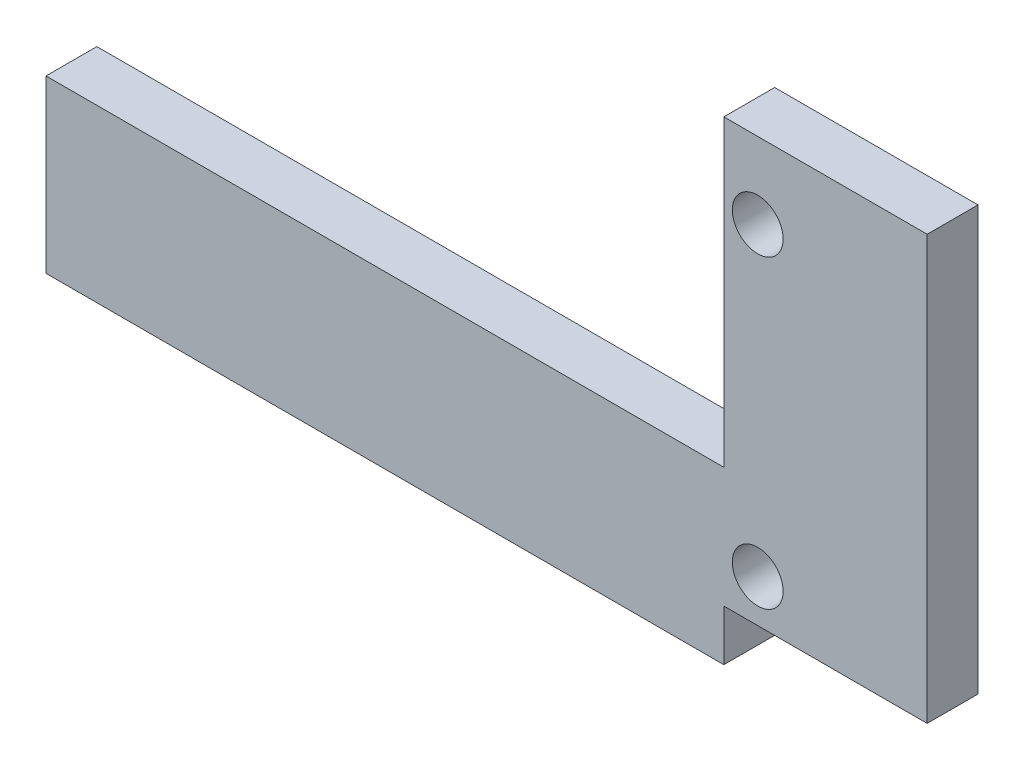
ISO-10303-21;
HEADER;
FILE_DESCRIPTION(('STEP AP214'),'2;1');
FILE_NAME('part.step','',(''),(''),'','','');
FILE_SCHEMA(('AUTOMOTIVE_DESIGN { 1 0 10303 214 1 1 1 1 }'));
ENDSEC;
DATA;
#1=APPLICATION_CONTEXT('core data for automotive mechanical design processes');
#2=APPLICATION_PROTOCOL_DEFINITION('international standard','automotive_design',2000,#1);
#3=PRODUCT_CONTEXT('',#1,'mechanical');
#4=PRODUCT('Part','Part','',(#3));
#5=PRODUCT_RELATED_PRODUCT_CATEGORY('part','',(#4));
#6=PRODUCT_DEFINITION_FORMATION('','',#4);
#7=PRODUCT_DEFINITION_CONTEXT('part definition',#1,'design');
#8=PRODUCT_DEFINITION('design','',#6,#7);
#9=PRODUCT_DEFINITION_SHAPE('','',#8);
#10=(LENGTH_UNIT() NAMED_UNIT(*) SI_UNIT(.MILLI.,.METRE.));
#11=(NAMED_UNIT(*) PLANE_ANGLE_UNIT() SI_UNIT($,.RADIAN.));
#12=(NAMED_UNIT(*) SI_UNIT($,.STERADIAN.) SOLID_ANGLE_UNIT());
#13=UNCERTAINTY_MEASURE_WITH_UNIT(LENGTH_MEASURE(1.E-05),#10,'distance_accuracy_value','');
#14=(GEOMETRIC_REPRESENTATION_CONTEXT(3) GLOBAL_UNCERTAINTY_ASSIGNED_CONTEXT((#13)) GLOBAL_UNIT_ASSIGNED_CONTEXT((#10,
#11,#12)) REPRESENTATION_CONTEXT('',''));
#15=CARTESIAN_POINT('',(0.,0.,0.));
#16=DIRECTION('',(0.,0.,1.));
#17=DIRECTION('',(1.,0.,0.));
#18=AXIS2_PLACEMENT_3D('',#15,#16,#17);
#19=CARTESIAN_POINT('',(-12.,0.,3.));
#20=DIRECTION('',(1.,0.,0.));
#21=DIRECTION('',(0.,0.,-1.));
#22=AXIS2_PLACEMENT_3D('',#19,#20,#21);
#23=PLANE('',#22);
#24=DIRECTION('',(0.,-1.,0.));
#25=VECTOR('',#24,1.);
#26=CARTESIAN_POINT('',(-12.,0.,0.));
#27=LINE('',#26,#25);
#28=CARTESIAN_POINT('',(-12.,25.,0.));
#29=VERTEX_POINT('',#28);
#30=CARTESIAN_POINT('',(-12.,7.09030838231861,0.));
#31=VERTEX_POINT('',#30);
#32=EDGE_CURVE('E108',#29,#31,#27,.T.);
#33=ORIENTED_EDGE('',*,*,#32,.T.);
#34=DIRECTION('',(0.,0.,-1.));
#35=VECTOR('',#34,1.);
#36=CARTESIAN_POINT('',(-12.,7.09030838231861,10.));
#37=LINE('',#36,#35);
#38=CARTESIAN_POINT('',(-12.,7.09030838231861,3.));
#39=VERTEX_POINT('',#38);
#40=EDGE_CURVE('E110',#39,#31,#37,.T.);
#41=ORIENTED_EDGE('',*,*,#40,.F.);
#42=DIRECTION('',(0.,-1.,0.));
#43=VECTOR('',#42,1.);
#44=CARTESIAN_POINT('',(-12.,0.,3.));
#45=LINE('',#44,#43);
#46=CARTESIAN_POINT('',(-12.,25.,3.));
#47=VERTEX_POINT('',#46);
#48=EDGE_CURVE('E161',#47,#39,#45,.T.);
#49=ORIENTED_EDGE('',*,*,#48,.F.);
#50=DIRECTION('',(0.,0.,-1.));
#51=VECTOR('',#50,1.);
#52=CARTESIAN_POINT('',(-12.,25.,3.));
#53=LINE('',#52,#51);
#54=EDGE_CURVE('E111',#47,#29,#53,.T.);
#55=ORIENTED_EDGE('',*,*,#54,.T.);
#56=EDGE_LOOP('',(#33,#41,#49,#55));
#57=FACE_BOUND('',#56,.T.);
#58=ADVANCED_FACE('F33',(#57),#23,.F.);
#59=CARTESIAN_POINT('',(0.,0.,3.));
#60=DIRECTION('',(-1.,0.,0.));
#61=DIRECTION('',(0.,0.,1.));
#62=AXIS2_PLACEMENT_3D('',#59,#60,#61);
#63=PLANE('',#62);
#64=DIRECTION('',(0.,1.,0.));
#65=VECTOR('',#64,1.);
#66=CARTESIAN_POINT('',(0.,0.,0.));
#67=LINE('',#66,#65);
#68=CARTESIAN_POINT('',(0.,0.,0.));
#69=VERTEX_POINT('',#68);
#70=CARTESIAN_POINT('',(0.,25.,0.));
#71=VERTEX_POINT('',#70);
#72=EDGE_CURVE('E157',#69,#71,#67,.T.);
#73=ORIENTED_EDGE('',*,*,#72,.T.);
#74=DIRECTION('',(0.,0.,-1.));
#75=VECTOR('',#74,1.);
#76=CARTESIAN_POINT('',(0.,25.,3.));
#77=LINE('',#76,#75);
#78=CARTESIAN_POINT('',(0.,25.,3.));
#79=VERTEX_POINT('',#78);
#80=EDGE_CURVE('E41',#79,#71,#77,.T.);
#81=ORIENTED_EDGE('',*,*,#80,.F.);
#82=DIRECTION('',(0.,1.,0.));
#83=VECTOR('',#82,1.);
#84=CARTESIAN_POINT('',(0.,0.,3.));
#85=LINE('',#84,#83);
#86=CARTESIAN_POINT('',(0.,0.,3.));
#87=VERTEX_POINT('',#86);
#88=EDGE_CURVE('E158',#87,#79,#85,.T.);
#89=ORIENTED_EDGE('',*,*,#88,.F.);
#90=DIRECTION('',(0.,0.,-1.));
#91=VECTOR('',#90,1.);
#92=CARTESIAN_POINT('',(0.,0.,3.));
#93=LINE('',#92,#91);
#94=EDGE_CURVE('E164',#87,#69,#93,.T.);
#95=ORIENTED_EDGE('',*,*,#94,.T.);
#96=EDGE_LOOP('',(#73,#81,#89,#95));
#97=FACE_BOUND('',#96,.T.);
#98=ADVANCED_FACE('F35',(#97),#63,.F.);
#99=CARTESIAN_POINT('',(0.,25.,3.));
#100=DIRECTION('',(0.,-1.,0.));
#101=DIRECTION('',(0.,0.,-1.));
#102=AXIS2_PLACEMENT_3D('',#99,#100,#101);
#103=PLANE('',#102);
#104=DIRECTION('',(-1.,0.,0.));
#105=VECTOR('',#104,1.);
#106=CARTESIAN_POINT('',(0.,25.,0.));
#107=LINE('',#106,#105);
#108=EDGE_CURVE('E113',#71,#29,#107,.T.);
#109=ORIENTED_EDGE('',*,*,#108,.T.);
#110=ORIENTED_EDGE('',*,*,#54,.F.);
#111=DIRECTION('',(-1.,0.,0.));
#112=VECTOR('',#111,1.);
#113=CARTESIAN_POINT('',(0.,25.,3.));
#114=LINE('',#113,#112);
#115=EDGE_CURVE('E84',#79,#47,#114,.T.);
#116=ORIENTED_EDGE('',*,*,#115,.F.);
#117=ORIENTED_EDGE('',*,*,#80,.T.);
#118=EDGE_LOOP('',(#109,#110,#116,#117));
#119=FACE_BOUND('',#118,.T.);
#120=ADVANCED_FACE('F173',(#119),#103,.F.);
#121=CARTESIAN_POINT('',(0.,0.,3.));
#122=DIRECTION('',(0.,1.,0.));
#123=DIRECTION('',(0.,0.,1.));
#124=AXIS2_PLACEMENT_3D('',#121,#122,#123);
#125=PLANE('',#124);
#126=DIRECTION('',(1.,0.,0.));
#127=VECTOR('',#126,1.);
#128=CARTESIAN_POINT('',(0.,0.,0.));
#129=LINE('',#128,#127);
#130=CARTESIAN_POINT('',(-12.,0.,0.));
#131=VERTEX_POINT('',#130);
#132=EDGE_CURVE('E76',#131,#69,#129,.T.);
#133=ORIENTED_EDGE('',*,*,#132,.T.);
#134=ORIENTED_EDGE('',*,*,#94,.F.);
#135=DIRECTION('',(1.,0.,0.));
#136=VECTOR('',#135,1.);
#137=CARTESIAN_POINT('',(0.,0.,3.));
#138=LINE('',#137,#136);
#139=CARTESIAN_POINT('',(-12.,0.,3.));
#140=VERTEX_POINT('',#139);
#141=EDGE_CURVE('E56',#140,#87,#138,.T.);
#142=ORIENTED_EDGE('',*,*,#141,.F.);
#143=DIRECTION('',(0.,0.,-1.));
#144=VECTOR('',#143,1.);
#145=CARTESIAN_POINT('',(-12.,0.,3.));
#146=LINE('',#145,#144);
#147=EDGE_CURVE('E170',#140,#131,#146,.T.);
#148=ORIENTED_EDGE('',*,*,#147,.T.);
#149=EDGE_LOOP('',(#133,#134,#142,#148));
#150=FACE_BOUND('',#149,.T.);
#151=ADVANCED_FACE('F193',(#150),#125,.F.);
#152=CARTESIAN_POINT('',(0.,0.,3.));
#153=DIRECTION('',(0.,0.,1.));
#154=DIRECTION('',(1.,0.,0.));
#155=AXIS2_PLACEMENT_3D('',#152,#153,#154);
#156=PLANE('',#155);
#157=ORIENTED_EDGE('',*,*,#48,.T.);
#158=DIRECTION('',(1.,0.,0.));
#159=VECTOR('',#158,1.);
#160=CARTESIAN_POINT('',(0.,7.09030838231861,3.));
#161=LINE('',#160,#159);
#162=CARTESIAN_POINT('',(-52.,7.09030838231861,3.));
#163=VERTEX_POINT('',#162);
#164=EDGE_CURVE('E118',#163,#39,#161,.T.);
#165=ORIENTED_EDGE('',*,*,#164,.F.);
#166=DIRECTION('',(0.,1.,0.));
#167=VECTOR('',#166,1.);
#168=CARTESIAN_POINT('',(-52.,11.0901796475247,3.));
#169=LINE('',#168,#167);
#170=CARTESIAN_POINT('',(-52.,-3.,3.));
#171=VERTEX_POINT('',#170);
#172=EDGE_CURVE('E132',#171,#163,#169,.T.);
#173=ORIENTED_EDGE('',*,*,#172,.F.);
#174=DIRECTION('',(1.,0.,0.));
#175=VECTOR('',#174,1.);
#176=CARTESIAN_POINT('',(-52.,-3.,3.));
#177=LINE('',#176,#175);
#178=CARTESIAN_POINT('',(-12.,-3.,3.));
#179=VERTEX_POINT('',#178);
#180=EDGE_CURVE('E135',#171,#179,#177,.T.);
#181=ORIENTED_EDGE('',*,*,#180,.T.);
#182=DIRECTION('',(0.,1.,0.));
#183=VECTOR('',#182,1.);
#184=CARTESIAN_POINT('',(-12.,11.0901796475247,3.));
#185=LINE('',#184,#183);
#186=EDGE_CURVE('E130',#179,#140,#185,.T.);
#187=ORIENTED_EDGE('',*,*,#186,.T.);
#188=ORIENTED_EDGE('',*,*,#141,.T.);
#189=ORIENTED_EDGE('',*,*,#88,.T.);
#190=ORIENTED_EDGE('',*,*,#115,.T.);
#191=EDGE_LOOP('',(#157,#165,#173,#181,#187,#188,#189,#190));
#192=FACE_BOUND('',#191,.T.);
#193=CARTESIAN_POINT('',(-10.,20.5,3.));
#194=DIRECTION('',(0.,0.,1.));
#195=DIRECTION('',(1.,0.,0.));
#196=AXIS2_PLACEMENT_3D('',#193,#194,#195);
#197=CIRCLE('',#196,1.5);
#198=CARTESIAN_POINT('',(-8.5,20.5,3.));
#199=VERTEX_POINT('',#198);
#200=EDGE_CURVE('E148',#199,#199,#197,.T.);
#201=ORIENTED_EDGE('',*,*,#200,.F.);
#202=EDGE_LOOP('',(#201));
#203=FACE_BOUND('',#202,.T.);
#204=CARTESIAN_POINT('',(-10.,2.5,3.));
#205=DIRECTION('',(0.,0.,1.));
#206=DIRECTION('',(1.,0.,0.));
#207=AXIS2_PLACEMENT_3D('',#204,#205,#206);
#208=CIRCLE('',#207,1.5);
#209=CARTESIAN_POINT('',(-8.5,2.5,3.));
#210=VERTEX_POINT('',#209);
#211=EDGE_CURVE('E154',#210,#210,#208,.T.);
#212=ORIENTED_EDGE('',*,*,#211,.F.);
#213=EDGE_LOOP('',(#212));
#214=FACE_BOUND('',#213,.T.);
#215=ADVANCED_FACE('F190',(#192,#203,#214),#156,.T.);
#216=CARTESIAN_POINT('',(0.,0.,0.));
#217=DIRECTION('',(0.,0.,1.));
#218=DIRECTION('',(1.,0.,0.));
#219=AXIS2_PLACEMENT_3D('',#216,#217,#218);
#220=PLANE('',#219);
#221=CARTESIAN_POINT('',(-10.,20.5,0.));
#222=DIRECTION('',(0.,0.,-1.));
#223=DIRECTION('',(-1.,0.,0.));
#224=AXIS2_PLACEMENT_3D('',#221,#222,#223);
#225=CIRCLE('',#224,1.5);
#226=CARTESIAN_POINT('',(-11.5,20.5,0.));
#227=VERTEX_POINT('',#226);
#228=EDGE_CURVE('E145',#227,#227,#225,.T.);
#229=ORIENTED_EDGE('',*,*,#228,.F.);
#230=EDGE_LOOP('',(#229));
#231=FACE_BOUND('',#230,.T.);
#232=CARTESIAN_POINT('',(-10.,2.5,0.));
#233=DIRECTION('',(0.,0.,-1.));
#234=DIRECTION('',(-1.,0.,0.));
#235=AXIS2_PLACEMENT_3D('',#232,#233,#234);
#236=CIRCLE('',#235,1.5);
#237=CARTESIAN_POINT('',(-11.5,2.5,0.));
#238=VERTEX_POINT('',#237);
#239=EDGE_CURVE('E151',#238,#238,#236,.T.);
#240=ORIENTED_EDGE('',*,*,#239,.F.);
#241=EDGE_LOOP('',(#240));
#242=FACE_BOUND('',#241,.T.);
#243=DIRECTION('',(-1.,0.,0.));
#244=VECTOR('',#243,1.);
#245=CARTESIAN_POINT('',(-12.,7.09030838231861,0.));
#246=LINE('',#245,#244);
#247=CARTESIAN_POINT('',(-52.,7.09030838231861,0.));
#248=VERTEX_POINT('',#247);
#249=EDGE_CURVE('E47',#31,#248,#246,.T.);
#250=ORIENTED_EDGE('',*,*,#249,.F.);
#251=ORIENTED_EDGE('',*,*,#32,.F.);
#252=ORIENTED_EDGE('',*,*,#108,.F.);
#253=ORIENTED_EDGE('',*,*,#72,.F.);
#254=ORIENTED_EDGE('',*,*,#132,.F.);
#255=DIRECTION('',(0.,-1.,0.));
#256=VECTOR('',#255,1.);
#257=CARTESIAN_POINT('',(-12.,11.0901796475247,0.));
#258=LINE('',#257,#256);
#259=CARTESIAN_POINT('',(-12.,-3.,0.));
#260=VERTEX_POINT('',#259);
#261=EDGE_CURVE('E127',#131,#260,#258,.T.);
#262=ORIENTED_EDGE('',*,*,#261,.T.);
#263=DIRECTION('',(1.,0.,0.));
#264=VECTOR('',#263,1.);
#265=CARTESIAN_POINT('',(-52.,-3.,0.));
#266=LINE('',#265,#264);
#267=CARTESIAN_POINT('',(-52.,-3.,0.));
#268=VERTEX_POINT('',#267);
#269=EDGE_CURVE('E142',#268,#260,#266,.T.);
#270=ORIENTED_EDGE('',*,*,#269,.F.);
#271=DIRECTION('',(0.,-1.,0.));
#272=VECTOR('',#271,1.);
#273=CARTESIAN_POINT('',(-52.,11.0901796475247,0.));
#274=LINE('',#273,#272);
#275=EDGE_CURVE('E123',#248,#268,#274,.T.);
#276=ORIENTED_EDGE('',*,*,#275,.F.);
#277=EDGE_LOOP('',(#250,#251,#252,#253,#254,#262,#270,#276));
#278=FACE_BOUND('',#277,.T.);
#279=ADVANCED_FACE('F121',(#231,#242,#278),#220,.F.);
#280=CARTESIAN_POINT('',(-10.,2.5,40.));
#281=DIRECTION('',(0.,0.,-1.));
#282=DIRECTION('',(-1.,0.,0.));
#283=AXIS2_PLACEMENT_3D('',#280,#281,#282);
#284=CYLINDRICAL_SURFACE('',#283,1.5);
#285=ORIENTED_EDGE('',*,*,#211,.T.);
#286=EDGE_LOOP('',(#285));
#287=FACE_BOUND('',#286,.T.);
#288=ORIENTED_EDGE('',*,*,#239,.T.);
#289=EDGE_LOOP('',(#288));
#290=FACE_BOUND('',#289,.T.);
#291=ADVANCED_FACE('F199',(#287,#290),#284,.F.);
#292=CARTESIAN_POINT('',(-10.,20.5,40.));
#293=DIRECTION('',(0.,0.,-1.));
#294=DIRECTION('',(-1.,0.,0.));
#295=AXIS2_PLACEMENT_3D('',#292,#293,#294);
#296=CYLINDRICAL_SURFACE('',#295,1.5);
#297=ORIENTED_EDGE('',*,*,#200,.T.);
#298=EDGE_LOOP('',(#297));
#299=FACE_BOUND('',#298,.T.);
#300=ORIENTED_EDGE('',*,*,#228,.T.);
#301=EDGE_LOOP('',(#300));
#302=FACE_BOUND('',#301,.T.);
#303=ADVANCED_FACE('F202',(#299,#302),#296,.F.);
#304=CARTESIAN_POINT('',(-52.,-3.,0.));
#305=DIRECTION('',(0.,1.,0.));
#306=DIRECTION('',(0.,0.,1.));
#307=AXIS2_PLACEMENT_3D('',#304,#305,#306);
#308=PLANE('',#307);
#309=DIRECTION('',(0.,0.,1.));
#310=VECTOR('',#309,1.);
#311=CARTESIAN_POINT('',(-12.,-3.,0.));
#312=LINE('',#311,#310);
#313=EDGE_CURVE('E137',#260,#179,#312,.T.);
#314=ORIENTED_EDGE('',*,*,#313,.T.);
#315=ORIENTED_EDGE('',*,*,#180,.F.);
#316=DIRECTION('',(0.,0.,1.));
#317=VECTOR('',#316,1.);
#318=CARTESIAN_POINT('',(-52.,-3.,0.));
#319=LINE('',#318,#317);
#320=EDGE_CURVE('E129',#268,#171,#319,.T.);
#321=ORIENTED_EDGE('',*,*,#320,.F.);
#322=ORIENTED_EDGE('',*,*,#269,.T.);
#323=EDGE_LOOP('',(#314,#315,#321,#322));
#324=FACE_BOUND('',#323,.T.);
#325=ADVANCED_FACE('F186',(#324),#308,.F.);
#326=CARTESIAN_POINT('',(-52.,0.,0.));
#327=DIRECTION('',(-1.,0.,0.));
#328=DIRECTION('',(0.,0.,1.));
#329=AXIS2_PLACEMENT_3D('',#326,#327,#328);
#330=PLANE('',#329);
#331=DIRECTION('',(0.,0.,1.));
#332=VECTOR('',#331,1.);
#333=CARTESIAN_POINT('',(-52.,7.09030838231861,0.));
#334=LINE('',#333,#332);
#335=EDGE_CURVE('E11',#248,#163,#334,.T.);
#336=ORIENTED_EDGE('',*,*,#335,.F.);
#337=ORIENTED_EDGE('',*,*,#275,.T.);
#338=ORIENTED_EDGE('',*,*,#320,.T.);
#339=ORIENTED_EDGE('',*,*,#172,.T.);
#340=EDGE_LOOP('',(#336,#337,#338,#339));
#341=FACE_BOUND('',#340,.T.);
#342=ADVANCED_FACE('F189',(#341),#330,.T.);
#343=CARTESIAN_POINT('',(-12.,0.,0.));
#344=DIRECTION('',(-1.,0.,0.));
#345=DIRECTION('',(0.,0.,1.));
#346=AXIS2_PLACEMENT_3D('',#343,#344,#345);
#347=PLANE('',#346);
#348=ORIENTED_EDGE('',*,*,#147,.F.);
#349=ORIENTED_EDGE('',*,*,#186,.F.);
#350=ORIENTED_EDGE('',*,*,#313,.F.);
#351=ORIENTED_EDGE('',*,*,#261,.F.);
#352=EDGE_LOOP('',(#348,#349,#350,#351));
#353=FACE_BOUND('',#352,.T.);
#354=ADVANCED_FACE('F181',(#353),#347,.F.);
#355=CARTESIAN_POINT('',(-12.,7.09030838231861,10.));
#356=DIRECTION('',(0.,-1.,0.));
#357=DIRECTION('',(0.,0.,-1.));
#358=AXIS2_PLACEMENT_3D('',#355,#356,#357);
#359=PLANE('',#358);
#360=ORIENTED_EDGE('',*,*,#164,.T.);
#361=ORIENTED_EDGE('',*,*,#40,.T.);
#362=ORIENTED_EDGE('',*,*,#249,.T.);
#363=ORIENTED_EDGE('',*,*,#335,.T.);
#364=EDGE_LOOP('',(#360,#361,#362,#363));
#365=FACE_BOUND('',#364,.T.);
#366=ADVANCED_FACE('F116',(#365),#359,.F.);
#367=CLOSED_SHELL('',(#58,#98,#120,#151,#215,#279,#291,#303,#325,#342,#354,#366));
#368=MANIFOLD_SOLID_BREP('B2',#367);
#369=ADVANCED_BREP_SHAPE_REPRESENTATION('',(#18,#368),#14);
#370=SHAPE_DEFINITION_REPRESENTATION(#9,#369);
ENDSEC;
END-ISO-10303-21;
